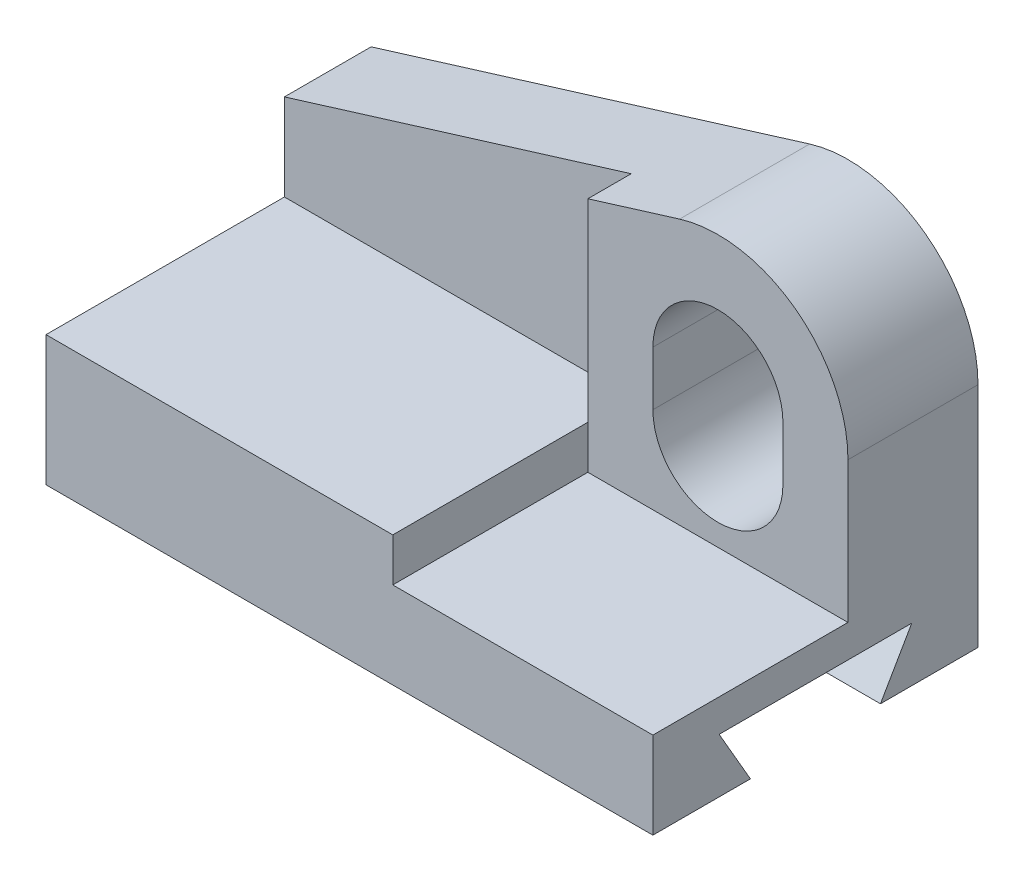
ISO-10303-21;
HEADER;
FILE_DESCRIPTION(('STEP AP214'),'2;1');
FILE_NAME('part.step','',(''),(''),'','','');
FILE_SCHEMA(('AUTOMOTIVE_DESIGN { 1 0 10303 214 1 1 1 1 }'));
ENDSEC;
DATA;
#1=APPLICATION_CONTEXT('core data for automotive mechanical design processes');
#2=APPLICATION_PROTOCOL_DEFINITION('international standard','automotive_design',2000,#1);
#3=PRODUCT_CONTEXT('',#1,'mechanical');
#4=PRODUCT('Part','Part','',(#3));
#5=PRODUCT_RELATED_PRODUCT_CATEGORY('part','',(#4));
#6=PRODUCT_DEFINITION_FORMATION('','',#4);
#7=PRODUCT_DEFINITION_CONTEXT('part definition',#1,'design');
#8=PRODUCT_DEFINITION('design','',#6,#7);
#9=PRODUCT_DEFINITION_SHAPE('','',#8);
#10=(LENGTH_UNIT() NAMED_UNIT(*) SI_UNIT(.MILLI.,.METRE.));
#11=(NAMED_UNIT(*) PLANE_ANGLE_UNIT() SI_UNIT($,.RADIAN.));
#12=(NAMED_UNIT(*) SI_UNIT($,.STERADIAN.) SOLID_ANGLE_UNIT());
#13=UNCERTAINTY_MEASURE_WITH_UNIT(LENGTH_MEASURE(1.E-05),#10,'distance_accuracy_value','');
#14=(GEOMETRIC_REPRESENTATION_CONTEXT(3) GLOBAL_UNCERTAINTY_ASSIGNED_CONTEXT((#13)) GLOBAL_UNIT_ASSIGNED_CONTEXT((#10,
#11,#12)) REPRESENTATION_CONTEXT('',''));
#15=CARTESIAN_POINT('',(0.,0.,0.));
#16=DIRECTION('',(0.,0.,1.));
#17=DIRECTION('',(1.,0.,0.));
#18=AXIS2_PLACEMENT_3D('',#15,#16,#17);
#19=CARTESIAN_POINT('',(0.,12.,0.));
#20=DIRECTION('',(0.,-1.,0.));
#21=DIRECTION('',(0.,0.,-1.));
#22=AXIS2_PLACEMENT_3D('',#19,#20,#21);
#23=PLANE('',#22);
#24=DIRECTION('',(1.,0.,0.));
#25=VECTOR('',#24,1.);
#26=CARTESIAN_POINT('',(0.,12.,-7.));
#27=LINE('',#26,#25);
#28=CARTESIAN_POINT('',(-28.,12.,-7.));
#29=VERTEX_POINT('',#28);
#30=CARTESIAN_POINT('',(4.,12.,-7.));
#31=VERTEX_POINT('',#30);
#32=EDGE_CURVE('E227',#29,#31,#27,.T.);
#33=ORIENTED_EDGE('',*,*,#32,.F.);
#34=DIRECTION('',(0.,0.,1.));
#35=VECTOR('',#34,1.);
#36=CARTESIAN_POINT('',(-28.,12.,15.));
#37=LINE('',#36,#35);
#38=CARTESIAN_POINT('',(-28.,12.,15.));
#39=VERTEX_POINT('',#38);
#40=EDGE_CURVE('E67',#29,#39,#37,.T.);
#41=ORIENTED_EDGE('',*,*,#40,.T.);
#42=DIRECTION('',(1.,0.,0.));
#43=VECTOR('',#42,1.);
#44=CARTESIAN_POINT('',(-28.,12.,15.));
#45=LINE('',#44,#43);
#46=CARTESIAN_POINT('',(4.,12.,15.));
#47=VERTEX_POINT('',#46);
#48=EDGE_CURVE('E108',#39,#47,#45,.T.);
#49=ORIENTED_EDGE('',*,*,#48,.T.);
#50=DIRECTION('',(0.,0.,1.));
#51=VECTOR('',#50,1.);
#52=CARTESIAN_POINT('',(4.,12.,-15.));
#53=LINE('',#52,#51);
#54=CARTESIAN_POINT('',(4.,12.,-3.));
#55=VERTEX_POINT('',#54);
#56=EDGE_CURVE('E176',#55,#47,#53,.T.);
#57=ORIENTED_EDGE('',*,*,#56,.F.);
#58=EDGE_CURVE('E172',#31,#55,#53,.T.);
#59=ORIENTED_EDGE('',*,*,#58,.F.);
#60=EDGE_LOOP('',(#33,#41,#49,#57,#59));
#61=FACE_BOUND('',#60,.T.);
#62=ADVANCED_FACE('F43',(#61),#23,.F.);
#63=CARTESIAN_POINT('',(28.,8.,-15.));
#64=DIRECTION('',(0.,-1.,0.));
#65=DIRECTION('',(1.,0.,0.));
#66=AXIS2_PLACEMENT_3D('',#63,#64,#65);
#67=PLANE('',#66);
#68=DIRECTION('',(0.,0.,1.));
#69=VECTOR('',#68,1.);
#70=CARTESIAN_POINT('',(28.,8.,-15.));
#71=LINE('',#70,#69);
#72=CARTESIAN_POINT('',(28.,8.,-3.));
#73=VERTEX_POINT('',#72);
#74=CARTESIAN_POINT('',(28.,8.,15.));
#75=VERTEX_POINT('',#74);
#76=EDGE_CURVE('E167',#73,#75,#71,.T.);
#77=ORIENTED_EDGE('',*,*,#76,.F.);
#78=DIRECTION('',(1.,0.,0.));
#79=VECTOR('',#78,1.);
#80=CARTESIAN_POINT('',(0.,8.,-3.));
#81=LINE('',#80,#79);
#82=CARTESIAN_POINT('',(4.,8.,-3.));
#83=VERTEX_POINT('',#82);
#84=EDGE_CURVE('E255',#83,#73,#81,.T.);
#85=ORIENTED_EDGE('',*,*,#84,.F.);
#86=DIRECTION('',(0.,0.,1.));
#87=VECTOR('',#86,1.);
#88=CARTESIAN_POINT('',(4.,8.,-15.));
#89=LINE('',#88,#87);
#90=CARTESIAN_POINT('',(4.,8.,15.));
#91=VERTEX_POINT('',#90);
#92=EDGE_CURVE('E175',#83,#91,#89,.T.);
#93=ORIENTED_EDGE('',*,*,#92,.T.);
#94=DIRECTION('',(1.,0.,0.));
#95=VECTOR('',#94,1.);
#96=CARTESIAN_POINT('',(28.,8.,15.));
#97=LINE('',#96,#95);
#98=EDGE_CURVE('E181',#91,#75,#97,.T.);
#99=ORIENTED_EDGE('',*,*,#98,.T.);
#100=EDGE_LOOP('',(#77,#85,#93,#99));
#101=FACE_BOUND('',#100,.T.);
#102=ADVANCED_FACE('F343',(#101),#67,.F.);
#103=CARTESIAN_POINT('',(4.,8.,-15.));
#104=DIRECTION('',(-1.,0.,0.));
#105=DIRECTION('',(0.,-1.,0.));
#106=AXIS2_PLACEMENT_3D('',#103,#104,#105);
#107=PLANE('',#106);
#108=ORIENTED_EDGE('',*,*,#92,.F.);
#109=DIRECTION('',(0.,1.,0.));
#110=VECTOR('',#109,1.);
#111=CARTESIAN_POINT('',(4.,0.,-3.));
#112=LINE('',#111,#110);
#113=EDGE_CURVE('E258',#83,#55,#112,.T.);
#114=ORIENTED_EDGE('',*,*,#113,.T.);
#115=ORIENTED_EDGE('',*,*,#56,.T.);
#116=DIRECTION('',(0.,-1.,0.));
#117=VECTOR('',#116,1.);
#118=CARTESIAN_POINT('',(4.,8.,15.));
#119=LINE('',#118,#117);
#120=EDGE_CURVE('E184',#47,#91,#119,.T.);
#121=ORIENTED_EDGE('',*,*,#120,.T.);
#122=EDGE_LOOP('',(#108,#114,#115,#121));
#123=FACE_BOUND('',#122,.T.);
#124=ADVANCED_FACE('F345',(#123),#107,.F.);
#125=CARTESIAN_POINT('',(0.,0.,0.));
#126=DIRECTION('',(0.,-1.,0.));
#127=DIRECTION('',(0.,0.,-1.));
#128=AXIS2_PLACEMENT_3D('',#125,#126,#127);
#129=PLANE('',#128);
#130=DIRECTION('',(-1.,0.,0.));
#131=VECTOR('',#130,1.);
#132=CARTESIAN_POINT('',(28.,0.,-6.));
#133=LINE('',#132,#131);
#134=CARTESIAN_POINT('',(28.,0.,-6.));
#135=VERTEX_POINT('',#134);
#136=CARTESIAN_POINT('',(-28.,0.,-6.));
#137=VERTEX_POINT('',#136);
#138=EDGE_CURVE('E145',#135,#137,#133,.T.);
#139=ORIENTED_EDGE('',*,*,#138,.T.);
#140=DIRECTION('',(0.,0.,1.));
#141=VECTOR('',#140,1.);
#142=CARTESIAN_POINT('',(-28.,0.,15.));
#143=LINE('',#142,#141);
#144=CARTESIAN_POINT('',(-28.,0.,-15.));
#145=VERTEX_POINT('',#144);
#146=EDGE_CURVE('E98',#145,#137,#143,.T.);
#147=ORIENTED_EDGE('',*,*,#146,.F.);
#148=DIRECTION('',(-1.,0.,0.));
#149=VECTOR('',#148,1.);
#150=CARTESIAN_POINT('',(-28.,0.,-15.));
#151=LINE('',#150,#149);
#152=CARTESIAN_POINT('',(28.,0.,-15.));
#153=VERTEX_POINT('',#152);
#154=EDGE_CURVE('E99',#153,#145,#151,.T.);
#155=ORIENTED_EDGE('',*,*,#154,.F.);
#156=DIRECTION('',(0.,0.,-1.));
#157=VECTOR('',#156,1.);
#158=CARTESIAN_POINT('',(28.,0.,15.));
#159=LINE('',#158,#157);
#160=EDGE_CURVE('E138',#135,#153,#159,.T.);
#161=ORIENTED_EDGE('',*,*,#160,.F.);
#162=EDGE_LOOP('',(#139,#147,#155,#161));
#163=FACE_BOUND('',#162,.T.);
#164=ADVANCED_FACE('F148',(#163),#129,.T.);
#165=CARTESIAN_POINT('',(28.,12.,15.));
#166=DIRECTION('',(-1.,0.,0.));
#167=DIRECTION('',(0.,0.,1.));
#168=AXIS2_PLACEMENT_3D('',#165,#166,#167);
#169=PLANE('',#168);
#170=DIRECTION('',(0.,1.,0.));
#171=VECTOR('',#170,1.);
#172=CARTESIAN_POINT('',(28.,0.,-3.));
#173=LINE('',#172,#171);
#174=CARTESIAN_POINT('',(28.,21.,-3.));
#175=VERTEX_POINT('',#174);
#176=EDGE_CURVE('E252',#73,#175,#173,.T.);
#177=ORIENTED_EDGE('',*,*,#176,.F.);
#178=ORIENTED_EDGE('',*,*,#76,.T.);
#179=DIRECTION('',(0.,-1.,0.));
#180=VECTOR('',#179,1.);
#181=CARTESIAN_POINT('',(28.,12.,15.));
#182=LINE('',#181,#180);
#183=CARTESIAN_POINT('',(28.,0.,15.));
#184=VERTEX_POINT('',#183);
#185=EDGE_CURVE('E110',#75,#184,#182,.T.);
#186=ORIENTED_EDGE('',*,*,#185,.T.);
#187=CARTESIAN_POINT('',(28.,0.,6.));
#188=VERTEX_POINT('',#187);
#189=EDGE_CURVE('E114',#184,#188,#159,.T.);
#190=ORIENTED_EDGE('',*,*,#189,.T.);
#191=DIRECTION('',(0.,0.866025403784436,0.500000000000004));
#192=VECTOR('',#191,1.);
#193=CARTESIAN_POINT('',(28.,5.,8.88675134594816));
#194=LINE('',#193,#192);
#195=CARTESIAN_POINT('',(28.,5.,8.88675134594816));
#196=VERTEX_POINT('',#195);
#197=EDGE_CURVE('E58',#188,#196,#194,.T.);
#198=ORIENTED_EDGE('',*,*,#197,.T.);
#199=DIRECTION('',(0.,0.,-1.));
#200=VECTOR('',#199,1.);
#201=CARTESIAN_POINT('',(28.,5.,-8.88675134594816));
#202=LINE('',#201,#200);
#203=CARTESIAN_POINT('',(28.,5.,-8.88675134594816));
#204=VERTEX_POINT('',#203);
#205=EDGE_CURVE('E169',#196,#204,#202,.T.);
#206=ORIENTED_EDGE('',*,*,#205,.T.);
#207=DIRECTION('',(0.,-0.866025403784436,0.500000000000004));
#208=VECTOR('',#207,1.);
#209=CARTESIAN_POINT('',(28.,0.,-6.));
#210=LINE('',#209,#208);
#211=EDGE_CURVE('E142',#204,#135,#210,.T.);
#212=ORIENTED_EDGE('',*,*,#211,.T.);
#213=ORIENTED_EDGE('',*,*,#160,.T.);
#214=DIRECTION('',(0.,-1.,0.));
#215=VECTOR('',#214,1.);
#216=CARTESIAN_POINT('',(28.,12.,-15.));
#217=LINE('',#216,#215);
#218=CARTESIAN_POINT('',(28.,21.,-15.));
#219=VERTEX_POINT('',#218);
#220=EDGE_CURVE('E51',#219,#153,#217,.T.);
#221=ORIENTED_EDGE('',*,*,#220,.F.);
#222=DIRECTION('',(0.,0.,-1.));
#223=VECTOR('',#222,1.);
#224=CARTESIAN_POINT('',(28.,21.,-7.));
#225=LINE('',#224,#223);
#226=EDGE_CURVE('E191',#175,#219,#225,.T.);
#227=ORIENTED_EDGE('',*,*,#226,.F.);
#228=EDGE_LOOP('',(#177,#178,#186,#190,#198,#206,#212,#213,#221,#227));
#229=FACE_BOUND('',#228,.T.);
#230=ADVANCED_FACE('F45',(#229),#169,.F.);
#231=CARTESIAN_POINT('',(-28.,12.,-15.));
#232=DIRECTION('',(0.,0.,1.));
#233=DIRECTION('',(1.,0.,0.));
#234=AXIS2_PLACEMENT_3D('',#231,#232,#233);
#235=PLANE('',#234);
#236=DIRECTION('',(0.,-1.,0.));
#237=VECTOR('',#236,1.);
#238=CARTESIAN_POINT('',(-28.,12.,-15.));
#239=LINE('',#238,#237);
#240=CARTESIAN_POINT('',(-28.,20.,-15.));
#241=VERTEX_POINT('',#240);
#242=EDGE_CURVE('E109',#241,#145,#239,.T.);
#243=ORIENTED_EDGE('',*,*,#242,.F.);
#244=DIRECTION('',(0.955667811903527,0.29444699572508,0.));
#245=VECTOR('',#244,1.);
#246=CARTESIAN_POINT('',(-8.0554432546858,26.1450377857018,-15.));
#247=LINE('',#246,#245);
#248=CARTESIAN_POINT('',(12.466636051299,32.4680137428423,-15.));
#249=VERTEX_POINT('',#248);
#250=EDGE_CURVE('E222',#241,#249,#247,.T.);
#251=ORIENTED_EDGE('',*,*,#250,.T.);
#252=CARTESIAN_POINT('',(16.,21.,-15.));
#253=DIRECTION('',(0.,0.,-1.));
#254=DIRECTION('',(-1.,0.,0.));
#255=AXIS2_PLACEMENT_3D('',#252,#253,#254);
#256=CIRCLE('',#255,12.);
#257=EDGE_CURVE('E132',#249,#219,#256,.T.);
#258=ORIENTED_EDGE('',*,*,#257,.T.);
#259=ORIENTED_EDGE('',*,*,#220,.T.);
#260=ORIENTED_EDGE('',*,*,#154,.T.);
#261=EDGE_LOOP('',(#243,#251,#258,#259,#260));
#262=FACE_BOUND('',#261,.T.);
#263=CARTESIAN_POINT('',(16.,21.,-15.));
#264=DIRECTION('',(0.,0.,-1.));
#265=DIRECTION('',(-1.,0.,0.));
#266=AXIS2_PLACEMENT_3D('',#263,#264,#265);
#267=CIRCLE('',#266,6.);
#268=CARTESIAN_POINT('',(10.,21.,-15.));
#269=VERTEX_POINT('',#268);
#270=CARTESIAN_POINT('',(22.,21.,-15.));
#271=VERTEX_POINT('',#270);
#272=EDGE_CURVE('E218',#269,#271,#267,.T.);
#273=ORIENTED_EDGE('',*,*,#272,.F.);
#274=DIRECTION('',(0.,1.,0.));
#275=VECTOR('',#274,1.);
#276=CARTESIAN_POINT('',(10.,0.,-15.));
#277=LINE('',#276,#275);
#278=CARTESIAN_POINT('',(10.,16.,-15.));
#279=VERTEX_POINT('',#278);
#280=EDGE_CURVE('E215',#279,#269,#277,.T.);
#281=ORIENTED_EDGE('',*,*,#280,.F.);
#282=CARTESIAN_POINT('',(16.,16.,-15.));
#283=DIRECTION('',(0.,0.,-1.));
#284=DIRECTION('',(-1.,0.,0.));
#285=AXIS2_PLACEMENT_3D('',#282,#283,#284);
#286=CIRCLE('',#285,6.);
#287=CARTESIAN_POINT('',(22.,16.,-15.));
#288=VERTEX_POINT('',#287);
#289=EDGE_CURVE('E212',#288,#279,#286,.T.);
#290=ORIENTED_EDGE('',*,*,#289,.F.);
#291=DIRECTION('',(0.,1.,0.));
#292=VECTOR('',#291,1.);
#293=CARTESIAN_POINT('',(22.,0.,-15.));
#294=LINE('',#293,#292);
#295=EDGE_CURVE('E208',#288,#271,#294,.T.);
#296=ORIENTED_EDGE('',*,*,#295,.T.);
#297=EDGE_LOOP('',(#273,#281,#290,#296));
#298=FACE_BOUND('',#297,.T.);
#299=ADVANCED_FACE('F126',(#262,#298),#235,.F.);
#300=CARTESIAN_POINT('',(-28.,12.,15.));
#301=DIRECTION('',(1.,0.,0.));
#302=DIRECTION('',(0.,0.,-1.));
#303=AXIS2_PLACEMENT_3D('',#300,#301,#302);
#304=PLANE('',#303);
#305=ORIENTED_EDGE('',*,*,#146,.T.);
#306=DIRECTION('',(0.,-0.866025403784436,0.500000000000004));
#307=VECTOR('',#306,1.);
#308=CARTESIAN_POINT('',(-28.,0.,-6.));
#309=LINE('',#308,#307);
#310=CARTESIAN_POINT('',(-28.,5.,-8.88675134594816));
#311=VERTEX_POINT('',#310);
#312=EDGE_CURVE('E160',#311,#137,#309,.T.);
#313=ORIENTED_EDGE('',*,*,#312,.F.);
#314=DIRECTION('',(0.,0.,-1.));
#315=VECTOR('',#314,1.);
#316=CARTESIAN_POINT('',(-28.,5.,-8.88675134594816));
#317=LINE('',#316,#315);
#318=CARTESIAN_POINT('',(-28.,5.,8.88675134594816));
#319=VERTEX_POINT('',#318);
#320=EDGE_CURVE('E163',#319,#311,#317,.T.);
#321=ORIENTED_EDGE('',*,*,#320,.F.);
#322=DIRECTION('',(0.,0.866025403784436,0.500000000000004));
#323=VECTOR('',#322,1.);
#324=CARTESIAN_POINT('',(-28.,5.,8.88675134594816));
#325=LINE('',#324,#323);
#326=CARTESIAN_POINT('',(-28.,0.,6.));
#327=VERTEX_POINT('',#326);
#328=EDGE_CURVE('E95',#327,#319,#325,.T.);
#329=ORIENTED_EDGE('',*,*,#328,.F.);
#330=CARTESIAN_POINT('',(-28.,0.,15.));
#331=VERTEX_POINT('',#330);
#332=EDGE_CURVE('E86',#327,#331,#143,.T.);
#333=ORIENTED_EDGE('',*,*,#332,.T.);
#334=DIRECTION('',(0.,-1.,0.));
#335=VECTOR('',#334,1.);
#336=CARTESIAN_POINT('',(-28.,12.,15.));
#337=LINE('',#336,#335);
#338=EDGE_CURVE('E90',#39,#331,#337,.T.);
#339=ORIENTED_EDGE('',*,*,#338,.F.);
#340=ORIENTED_EDGE('',*,*,#40,.F.);
#341=DIRECTION('',(0.,1.,0.));
#342=VECTOR('',#341,1.);
#343=CARTESIAN_POINT('',(-28.,0.,-7.));
#344=LINE('',#343,#342);
#345=CARTESIAN_POINT('',(-28.,20.,-7.));
#346=VERTEX_POINT('',#345);
#347=EDGE_CURVE('E192',#29,#346,#344,.T.);
#348=ORIENTED_EDGE('',*,*,#347,.T.);
#349=DIRECTION('',(0.,0.,-1.));
#350=VECTOR('',#349,1.);
#351=CARTESIAN_POINT('',(-28.,20.,-7.));
#352=LINE('',#351,#350);
#353=EDGE_CURVE('E194',#346,#241,#352,.T.);
#354=ORIENTED_EDGE('',*,*,#353,.T.);
#355=ORIENTED_EDGE('',*,*,#242,.T.);
#356=EDGE_LOOP('',(#305,#313,#321,#329,#333,#339,#340,#348,#354,#355));
#357=FACE_BOUND('',#356,.T.);
#358=ADVANCED_FACE('F89',(#357),#304,.F.);
#359=CARTESIAN_POINT('',(-28.,12.,15.));
#360=DIRECTION('',(0.,0.,-1.));
#361=DIRECTION('',(-1.,0.,0.));
#362=AXIS2_PLACEMENT_3D('',#359,#360,#361);
#363=PLANE('',#362);
#364=ORIENTED_EDGE('',*,*,#185,.F.);
#365=ORIENTED_EDGE('',*,*,#98,.F.);
#366=ORIENTED_EDGE('',*,*,#120,.F.);
#367=ORIENTED_EDGE('',*,*,#48,.F.);
#368=ORIENTED_EDGE('',*,*,#338,.T.);
#369=DIRECTION('',(1.,0.,0.));
#370=VECTOR('',#369,1.);
#371=CARTESIAN_POINT('',(-28.,0.,15.));
#372=LINE('',#371,#370);
#373=EDGE_CURVE('E105',#331,#184,#372,.T.);
#374=ORIENTED_EDGE('',*,*,#373,.T.);
#375=EDGE_LOOP('',(#364,#365,#366,#367,#368,#374));
#376=FACE_BOUND('',#375,.T.);
#377=ADVANCED_FACE('F104',(#376),#363,.F.);
#378=DIRECTION('',(-1.,0.,0.));
#379=VECTOR('',#378,1.);
#380=CARTESIAN_POINT('',(28.,0.,6.));
#381=LINE('',#380,#379);
#382=EDGE_CURVE('E151',#188,#327,#381,.T.);
#383=ORIENTED_EDGE('',*,*,#382,.F.);
#384=ORIENTED_EDGE('',*,*,#189,.F.);
#385=ORIENTED_EDGE('',*,*,#373,.F.);
#386=ORIENTED_EDGE('',*,*,#332,.F.);
#387=EDGE_LOOP('',(#383,#384,#385,#386));
#388=FACE_BOUND('',#387,.T.);
#389=ADVANCED_FACE('F112',(#388),#129,.T.);
#390=CARTESIAN_POINT('',(28.,0.,-6.));
#391=DIRECTION('',(0.,-0.500000000000004,-0.866025403784436));
#392=DIRECTION('',(0.,0.866025403784436,-0.500000000000005));
#393=AXIS2_PLACEMENT_3D('',#390,#391,#392);
#394=PLANE('',#393);
#395=ORIENTED_EDGE('',*,*,#312,.T.);
#396=ORIENTED_EDGE('',*,*,#138,.F.);
#397=ORIENTED_EDGE('',*,*,#211,.F.);
#398=DIRECTION('',(-1.,0.,0.));
#399=VECTOR('',#398,1.);
#400=CARTESIAN_POINT('',(28.,5.,-8.88675134594816));
#401=LINE('',#400,#399);
#402=EDGE_CURVE('E156',#204,#311,#401,.T.);
#403=ORIENTED_EDGE('',*,*,#402,.T.);
#404=EDGE_LOOP('',(#395,#396,#397,#403));
#405=FACE_BOUND('',#404,.T.);
#406=ADVANCED_FACE('F332',(#405),#394,.F.);
#407=CARTESIAN_POINT('',(28.,5.,-8.88675134594816));
#408=DIRECTION('',(0.,1.,0.));
#409=DIRECTION('',(0.,0.,1.));
#410=AXIS2_PLACEMENT_3D('',#407,#408,#409);
#411=PLANE('',#410);
#412=ORIENTED_EDGE('',*,*,#320,.T.);
#413=ORIENTED_EDGE('',*,*,#402,.F.);
#414=ORIENTED_EDGE('',*,*,#205,.F.);
#415=DIRECTION('',(-1.,0.,0.));
#416=VECTOR('',#415,1.);
#417=CARTESIAN_POINT('',(28.,5.,8.88675134594816));
#418=LINE('',#417,#416);
#419=EDGE_CURVE('E153',#196,#319,#418,.T.);
#420=ORIENTED_EDGE('',*,*,#419,.T.);
#421=EDGE_LOOP('',(#412,#413,#414,#420));
#422=FACE_BOUND('',#421,.T.);
#423=ADVANCED_FACE('F349',(#422),#411,.F.);
#424=CARTESIAN_POINT('',(28.,5.,8.88675134594816));
#425=DIRECTION('',(0.,-0.500000000000004,0.866025403784436));
#426=DIRECTION('',(0.,-0.866025403784436,-0.500000000000004));
#427=AXIS2_PLACEMENT_3D('',#424,#425,#426);
#428=PLANE('',#427);
#429=ORIENTED_EDGE('',*,*,#328,.T.);
#430=ORIENTED_EDGE('',*,*,#419,.F.);
#431=ORIENTED_EDGE('',*,*,#197,.F.);
#432=ORIENTED_EDGE('',*,*,#382,.T.);
#433=EDGE_LOOP('',(#429,#430,#431,#432));
#434=FACE_BOUND('',#433,.T.);
#435=ADVANCED_FACE('F350',(#434),#428,.F.);
#436=CARTESIAN_POINT('',(16.,21.,-7.));
#437=DIRECTION('',(0.,0.,-1.));
#438=DIRECTION('',(-1.,0.,0.));
#439=AXIS2_PLACEMENT_3D('',#436,#437,#438);
#440=CYLINDRICAL_SURFACE('',#439,6.);
#441=ORIENTED_EDGE('',*,*,#272,.T.);
#442=DIRECTION('',(0.,0.,-1.));
#443=VECTOR('',#442,1.);
#444=CARTESIAN_POINT('',(22.,21.,-7.));
#445=LINE('',#444,#443);
#446=CARTESIAN_POINT('',(22.,21.,-3.));
#447=VERTEX_POINT('',#446);
#448=EDGE_CURVE('E187',#447,#271,#445,.T.);
#449=ORIENTED_EDGE('',*,*,#448,.F.);
#450=CARTESIAN_POINT('',(16.,21.,-3.));
#451=DIRECTION('',(0.,0.,1.));
#452=DIRECTION('',(1.,0.,0.));
#453=AXIS2_PLACEMENT_3D('',#450,#451,#452);
#454=CIRCLE('',#453,6.);
#455=CARTESIAN_POINT('',(10.,21.,-3.));
#456=VERTEX_POINT('',#455);
#457=EDGE_CURVE('E240',#456,#447,#454,.F.);
#458=ORIENTED_EDGE('',*,*,#457,.F.);
#459=DIRECTION('',(0.,0.,-1.));
#460=VECTOR('',#459,1.);
#461=CARTESIAN_POINT('',(10.,21.,-7.));
#462=LINE('',#461,#460);
#463=EDGE_CURVE('E197',#456,#269,#462,.T.);
#464=ORIENTED_EDGE('',*,*,#463,.T.);
#465=EDGE_LOOP('',(#441,#449,#458,#464));
#466=FACE_BOUND('',#465,.T.);
#467=ADVANCED_FACE('F352',(#466),#440,.F.);
#468=CARTESIAN_POINT('',(22.,0.,-7.));
#469=DIRECTION('',(-1.,0.,0.));
#470=DIRECTION('',(0.,0.,1.));
#471=AXIS2_PLACEMENT_3D('',#468,#469,#470);
#472=PLANE('',#471);
#473=ORIENTED_EDGE('',*,*,#295,.F.);
#474=DIRECTION('',(0.,0.,-1.));
#475=VECTOR('',#474,1.);
#476=CARTESIAN_POINT('',(22.,16.,-7.));
#477=LINE('',#476,#475);
#478=CARTESIAN_POINT('',(22.,16.,-3.));
#479=VERTEX_POINT('',#478);
#480=EDGE_CURVE('E203',#479,#288,#477,.T.);
#481=ORIENTED_EDGE('',*,*,#480,.F.);
#482=DIRECTION('',(0.,-1.,0.));
#483=VECTOR('',#482,1.);
#484=CARTESIAN_POINT('',(22.,0.,-3.));
#485=LINE('',#484,#483);
#486=EDGE_CURVE('E237',#447,#479,#485,.T.);
#487=ORIENTED_EDGE('',*,*,#486,.F.);
#488=ORIENTED_EDGE('',*,*,#448,.T.);
#489=EDGE_LOOP('',(#473,#481,#487,#488));
#490=FACE_BOUND('',#489,.T.);
#491=ADVANCED_FACE('F359',(#490),#472,.T.);
#492=CARTESIAN_POINT('',(16.,16.,-7.));
#493=DIRECTION('',(0.,0.,-1.));
#494=DIRECTION('',(-1.,0.,0.));
#495=AXIS2_PLACEMENT_3D('',#492,#493,#494);
#496=CYLINDRICAL_SURFACE('',#495,6.);
#497=ORIENTED_EDGE('',*,*,#289,.T.);
#498=DIRECTION('',(0.,0.,-1.));
#499=VECTOR('',#498,1.);
#500=CARTESIAN_POINT('',(10.,16.,-7.));
#501=LINE('',#500,#499);
#502=CARTESIAN_POINT('',(10.,16.,-3.));
#503=VERTEX_POINT('',#502);
#504=EDGE_CURVE('E200',#503,#279,#501,.T.);
#505=ORIENTED_EDGE('',*,*,#504,.F.);
#506=CARTESIAN_POINT('',(16.,16.,-3.));
#507=DIRECTION('',(0.,0.,1.));
#508=DIRECTION('',(1.,0.,0.));
#509=AXIS2_PLACEMENT_3D('',#506,#507,#508);
#510=CIRCLE('',#509,6.);
#511=EDGE_CURVE('E234',#479,#503,#510,.F.);
#512=ORIENTED_EDGE('',*,*,#511,.F.);
#513=ORIENTED_EDGE('',*,*,#480,.T.);
#514=EDGE_LOOP('',(#497,#505,#512,#513));
#515=FACE_BOUND('',#514,.T.);
#516=ADVANCED_FACE('F467',(#515),#496,.F.);
#517=CARTESIAN_POINT('',(-8.0554432546858,26.1450377857018,-7.));
#518=DIRECTION('',(-0.29444699572508,0.955667811903527,0.));
#519=DIRECTION('',(-0.955667811903527,-0.29444699572508,0.));
#520=AXIS2_PLACEMENT_3D('',#517,#518,#519);
#521=PLANE('',#520);
#522=ORIENTED_EDGE('',*,*,#250,.F.);
#523=ORIENTED_EDGE('',*,*,#353,.F.);
#524=DIRECTION('',(0.955667811903527,0.29444699572508,0.));
#525=VECTOR('',#524,1.);
#526=CARTESIAN_POINT('',(-8.0554432546858,26.1450377857018,-7.));
#527=LINE('',#526,#525);
#528=CARTESIAN_POINT('',(4.,29.8593922970315,-7.));
#529=VERTEX_POINT('',#528);
#530=EDGE_CURVE('E211',#346,#529,#527,.T.);
#531=ORIENTED_EDGE('',*,*,#530,.T.);
#532=DIRECTION('',(0.,0.,-1.));
#533=VECTOR('',#532,1.);
#534=CARTESIAN_POINT('',(4.,29.8593922970315,-3.));
#535=LINE('',#534,#533);
#536=CARTESIAN_POINT('',(4.,29.8593922970315,-3.));
#537=VERTEX_POINT('',#536);
#538=EDGE_CURVE('E224',#537,#529,#535,.T.);
#539=ORIENTED_EDGE('',*,*,#538,.F.);
#540=DIRECTION('',(-0.955667811903527,-0.29444699572508,0.));
#541=VECTOR('',#540,1.);
#542=CARTESIAN_POINT('',(-8.0554432546858,26.1450377857018,-3.));
#543=LINE('',#542,#541);
#544=CARTESIAN_POINT('',(12.466636051299,32.4680137428423,-3.));
#545=VERTEX_POINT('',#544);
#546=EDGE_CURVE('E246',#545,#537,#543,.T.);
#547=ORIENTED_EDGE('',*,*,#546,.F.);
#548=DIRECTION('',(0.,0.,-1.));
#549=VECTOR('',#548,1.);
#550=CARTESIAN_POINT('',(12.466636051299,32.4680137428423,-7.));
#551=LINE('',#550,#549);
#552=EDGE_CURVE('E188',#545,#249,#551,.T.);
#553=ORIENTED_EDGE('',*,*,#552,.T.);
#554=EDGE_LOOP('',(#522,#523,#531,#539,#547,#553));
#555=FACE_BOUND('',#554,.T.);
#556=ADVANCED_FACE('F286',(#555),#521,.T.);
#557=CARTESIAN_POINT('',(16.,21.,-7.));
#558=DIRECTION('',(0.,0.,-1.));
#559=DIRECTION('',(-1.,0.,0.));
#560=AXIS2_PLACEMENT_3D('',#557,#558,#559);
#561=CYLINDRICAL_SURFACE('',#560,12.);
#562=ORIENTED_EDGE('',*,*,#257,.F.);
#563=ORIENTED_EDGE('',*,*,#552,.F.);
#564=CARTESIAN_POINT('',(16.,21.,-3.));
#565=DIRECTION('',(0.,0.,1.));
#566=DIRECTION('',(1.,0.,0.));
#567=AXIS2_PLACEMENT_3D('',#564,#565,#566);
#568=CIRCLE('',#567,12.);
#569=EDGE_CURVE('E249',#175,#545,#568,.T.);
#570=ORIENTED_EDGE('',*,*,#569,.F.);
#571=ORIENTED_EDGE('',*,*,#226,.T.);
#572=EDGE_LOOP('',(#562,#563,#570,#571));
#573=FACE_BOUND('',#572,.T.);
#574=ADVANCED_FACE('F335',(#573),#561,.T.);
#575=CARTESIAN_POINT('',(10.,0.,-7.));
#576=DIRECTION('',(-1.,0.,0.));
#577=DIRECTION('',(0.,0.,1.));
#578=AXIS2_PLACEMENT_3D('',#575,#576,#577);
#579=PLANE('',#578);
#580=ORIENTED_EDGE('',*,*,#280,.T.);
#581=ORIENTED_EDGE('',*,*,#463,.F.);
#582=DIRECTION('',(0.,1.,0.));
#583=VECTOR('',#582,1.);
#584=CARTESIAN_POINT('',(10.,0.,-3.));
#585=LINE('',#584,#583);
#586=EDGE_CURVE('E243',#503,#456,#585,.T.);
#587=ORIENTED_EDGE('',*,*,#586,.F.);
#588=ORIENTED_EDGE('',*,*,#504,.T.);
#589=EDGE_LOOP('',(#580,#581,#587,#588));
#590=FACE_BOUND('',#589,.T.);
#591=ADVANCED_FACE('F502',(#590),#579,.F.);
#592=CARTESIAN_POINT('',(0.,0.,-7.));
#593=DIRECTION('',(0.,0.,-1.));
#594=DIRECTION('',(-1.,0.,0.));
#595=AXIS2_PLACEMENT_3D('',#592,#593,#594);
#596=PLANE('',#595);
#597=ORIENTED_EDGE('',*,*,#32,.T.);
#598=DIRECTION('',(0.,1.,0.));
#599=VECTOR('',#598,1.);
#600=CARTESIAN_POINT('',(4.,0.,-7.));
#601=LINE('',#600,#599);
#602=EDGE_CURVE('E11',#31,#529,#601,.T.);
#603=ORIENTED_EDGE('',*,*,#602,.T.);
#604=ORIENTED_EDGE('',*,*,#530,.F.);
#605=ORIENTED_EDGE('',*,*,#347,.F.);
#606=EDGE_LOOP('',(#597,#603,#604,#605));
#607=FACE_BOUND('',#606,.T.);
#608=ADVANCED_FACE('F294',(#607),#596,.F.);
#609=CARTESIAN_POINT('',(4.,0.,-3.));
#610=DIRECTION('',(-1.,0.,0.));
#611=DIRECTION('',(0.,-1.,0.));
#612=AXIS2_PLACEMENT_3D('',#609,#610,#611);
#613=PLANE('',#612);
#614=ORIENTED_EDGE('',*,*,#58,.T.);
#615=EDGE_CURVE('E260',#55,#537,#112,.T.);
#616=ORIENTED_EDGE('',*,*,#615,.T.);
#617=ORIENTED_EDGE('',*,*,#538,.T.);
#618=ORIENTED_EDGE('',*,*,#602,.F.);
#619=EDGE_LOOP('',(#614,#616,#617,#618));
#620=FACE_BOUND('',#619,.T.);
#621=ADVANCED_FACE('F271',(#620),#613,.T.);
#622=CARTESIAN_POINT('',(0.,0.,-3.));
#623=DIRECTION('',(0.,0.,1.));
#624=DIRECTION('',(1.,0.,0.));
#625=AXIS2_PLACEMENT_3D('',#622,#623,#624);
#626=PLANE('',#625);
#627=ORIENTED_EDGE('',*,*,#113,.F.);
#628=ORIENTED_EDGE('',*,*,#84,.T.);
#629=ORIENTED_EDGE('',*,*,#176,.T.);
#630=ORIENTED_EDGE('',*,*,#569,.T.);
#631=ORIENTED_EDGE('',*,*,#546,.T.);
#632=ORIENTED_EDGE('',*,*,#615,.F.);
#633=EDGE_LOOP('',(#627,#628,#629,#630,#631,#632));
#634=FACE_BOUND('',#633,.T.);
#635=ORIENTED_EDGE('',*,*,#586,.T.);
#636=ORIENTED_EDGE('',*,*,#457,.T.);
#637=ORIENTED_EDGE('',*,*,#486,.T.);
#638=ORIENTED_EDGE('',*,*,#511,.T.);
#639=EDGE_LOOP('',(#635,#636,#637,#638));
#640=FACE_BOUND('',#639,.T.);
#641=ADVANCED_FACE('F281',(#634,#640),#626,.T.);
#642=CLOSED_SHELL('',(#62,#102,#124,#164,#230,#299,#358,#377,#389,#406,#423,#435,#467,#491,#516,
#556,#574,#591,#608,#621,#641));
#643=MANIFOLD_SOLID_BREP('B2',#642);
#644=ADVANCED_BREP_SHAPE_REPRESENTATION('',(#18,#643),#14);
#645=SHAPE_DEFINITION_REPRESENTATION(#9,#644);
ENDSEC;
END-ISO-10303-21;
